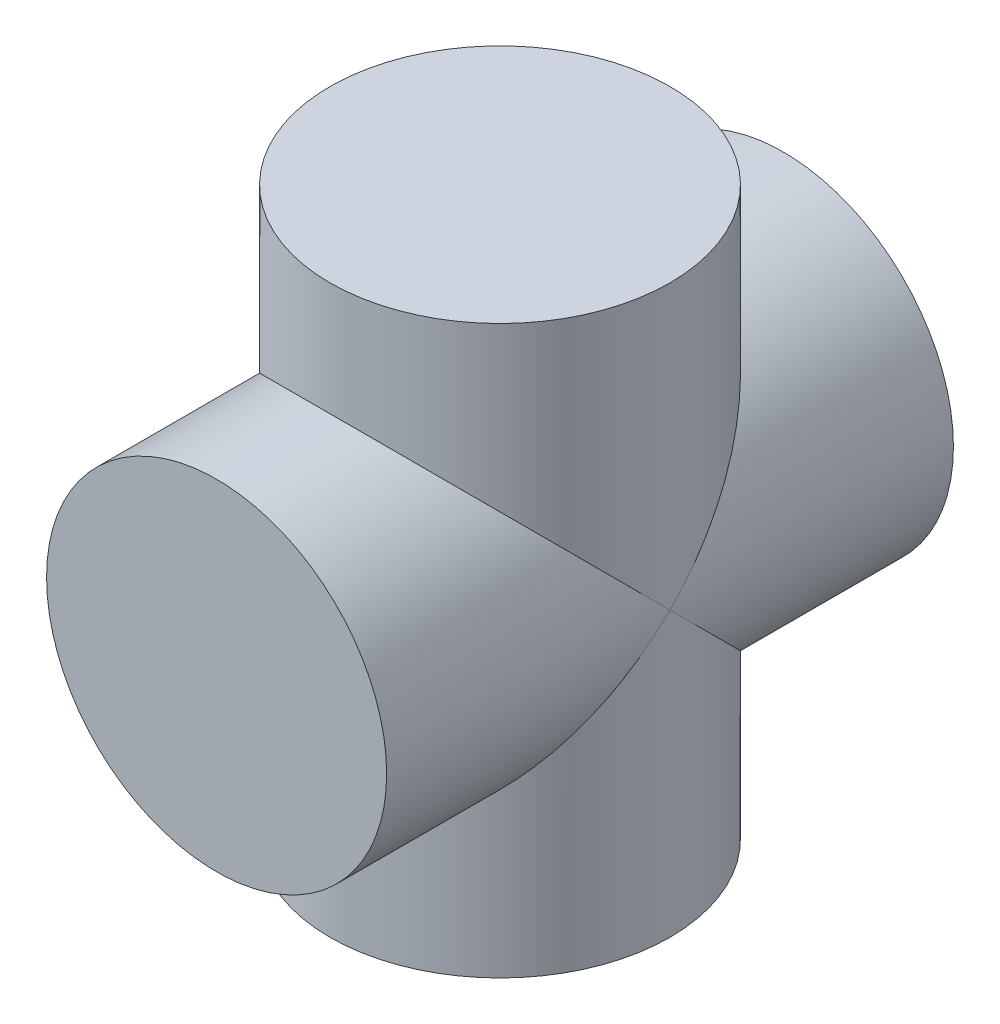
ISO-10303-21;
HEADER;
FILE_DESCRIPTION(('STEP AP214'),'2;1');
FILE_NAME('part.step','',(''),(''),'','','');
FILE_SCHEMA(('AUTOMOTIVE_DESIGN { 1 0 10303 214 1 1 1 1 }'));
ENDSEC;
DATA;
#1=APPLICATION_CONTEXT('core data for automotive mechanical design processes');
#2=APPLICATION_PROTOCOL_DEFINITION('international standard','automotive_design',2000,#1);
#3=PRODUCT_CONTEXT('',#1,'mechanical');
#4=PRODUCT('Part','Part','',(#3));
#5=PRODUCT_RELATED_PRODUCT_CATEGORY('part','',(#4));
#6=PRODUCT_DEFINITION_FORMATION('','',#4);
#7=PRODUCT_DEFINITION_CONTEXT('part definition',#1,'design');
#8=PRODUCT_DEFINITION('design','',#6,#7);
#9=PRODUCT_DEFINITION_SHAPE('','',#8);
#10=(LENGTH_UNIT() NAMED_UNIT(*) SI_UNIT(.MILLI.,.METRE.));
#11=(NAMED_UNIT(*) PLANE_ANGLE_UNIT() SI_UNIT($,.RADIAN.));
#12=(NAMED_UNIT(*) SI_UNIT($,.STERADIAN.) SOLID_ANGLE_UNIT());
#13=UNCERTAINTY_MEASURE_WITH_UNIT(LENGTH_MEASURE(1.E-05),#10,'distance_accuracy_value','');
#14=(GEOMETRIC_REPRESENTATION_CONTEXT(3) GLOBAL_UNCERTAINTY_ASSIGNED_CONTEXT((#13)) GLOBAL_UNIT_ASSIGNED_CONTEXT((#10,
#11,#12)) REPRESENTATION_CONTEXT('',''));
#15=CARTESIAN_POINT('',(0.,0.,0.));
#16=DIRECTION('',(0.,0.,1.));
#17=DIRECTION('',(1.,0.,0.));
#18=AXIS2_PLACEMENT_3D('',#15,#16,#17);
#19=CARTESIAN_POINT('',(0.,0.,50.));
#20=DIRECTION('',(0.,0.,-1.));
#21=DIRECTION('',(-1.,0.,0.));
#22=AXIS2_PLACEMENT_3D('',#19,#20,#21);
#23=CYLINDRICAL_SURFACE('',#22,30.);
#24=CARTESIAN_POINT('',(0.,0.,50.));
#25=DIRECTION('',(0.,0.,1.));
#26=DIRECTION('',(1.,0.,0.));
#27=AXIS2_PLACEMENT_3D('',#24,#25,#26);
#28=CIRCLE('',#27,30.);
#29=CARTESIAN_POINT('',(30.,0.,50.));
#30=VERTEX_POINT('',#29);
#31=EDGE_CURVE('E61',#30,#30,#28,.T.);
#32=ORIENTED_EDGE('',*,*,#31,.F.);
#33=EDGE_LOOP('',(#32));
#34=FACE_BOUND('',#33,.T.);
#35=CARTESIAN_POINT('',(0.,0.,0.));
#36=DIRECTION('',(0.,-0.707106781186547,-0.707106781186547));
#37=DIRECTION('',(0.,0.707106781186547,-0.707106781186547));
#38=AXIS2_PLACEMENT_3D('',#35,#36,#37);
#39=ELLIPSE('',#38,42.4264068711928,30.);
#40=CARTESIAN_POINT('',(30.,0.,0.));
#41=VERTEX_POINT('',#40);
#42=CARTESIAN_POINT('',(-30.,0.,0.));
#43=VERTEX_POINT('',#42);
#44=EDGE_CURVE('E45',#41,#43,#39,.T.);
#45=ORIENTED_EDGE('',*,*,#44,.F.);
#46=CARTESIAN_POINT('',(0.,0.,0.));
#47=DIRECTION('',(0.,0.707106781186547,-0.707106781186547));
#48=DIRECTION('',(0.,-0.707106781186547,-0.707106781186547));
#49=AXIS2_PLACEMENT_3D('',#46,#47,#48);
#50=ELLIPSE('',#49,42.4264068711928,30.);
#51=EDGE_CURVE('E57',#43,#41,#50,.T.);
#52=ORIENTED_EDGE('',*,*,#51,.F.);
#53=EDGE_LOOP('',(#45,#52));
#54=FACE_BOUND('',#53,.T.);
#55=ADVANCED_FACE('F37',(#34,#54),#23,.T.);
#56=CARTESIAN_POINT('',(0.,0.,50.));
#57=DIRECTION('',(0.,0.,1.));
#58=DIRECTION('',(1.,0.,0.));
#59=AXIS2_PLACEMENT_3D('',#56,#57,#58);
#60=PLANE('',#59);
#61=ORIENTED_EDGE('',*,*,#31,.T.);
#62=EDGE_LOOP('',(#61));
#63=FACE_BOUND('',#62,.T.);
#64=ADVANCED_FACE('F84',(#63),#60,.T.);
#65=CARTESIAN_POINT('',(0.,-50.,0.));
#66=DIRECTION('',(0.,1.,0.));
#67=DIRECTION('',(0.,0.,1.));
#68=AXIS2_PLACEMENT_3D('',#65,#66,#67);
#69=PLANE('',#68);
#70=CARTESIAN_POINT('',(0.,-50.,0.));
#71=DIRECTION('',(0.,1.,0.));
#72=DIRECTION('',(0.,0.,1.));
#73=AXIS2_PLACEMENT_3D('',#70,#71,#72);
#74=CIRCLE('',#73,30.);
#75=CARTESIAN_POINT('',(0.,-50.,30.));
#76=VERTEX_POINT('',#75);
#77=EDGE_CURVE('E98',#76,#76,#74,.T.);
#78=ORIENTED_EDGE('',*,*,#77,.F.);
#79=EDGE_LOOP('',(#78));
#80=FACE_BOUND('',#79,.T.);
#81=ADVANCED_FACE('F81',(#80),#69,.F.);
#82=CARTESIAN_POINT('',(0.,50.,0.));
#83=DIRECTION('',(0.,-1.,0.));
#84=DIRECTION('',(0.,0.,-1.));
#85=AXIS2_PLACEMENT_3D('',#82,#83,#84);
#86=CYLINDRICAL_SURFACE('',#85,30.);
#87=ORIENTED_EDGE('',*,*,#77,.T.);
#88=EDGE_LOOP('',(#87));
#89=FACE_BOUND('',#88,.T.);
#90=CARTESIAN_POINT('',(0.,0.,0.));
#91=DIRECTION('',(0.,0.707106781186547,-0.707106781186547));
#92=DIRECTION('',(0.,-0.707106781186547,-0.707106781186547));
#93=AXIS2_PLACEMENT_3D('',#90,#91,#92);
#94=ELLIPSE('',#93,42.4264068711928,30.);
#95=EDGE_CURVE('E51',#43,#41,#94,.F.);
#96=ORIENTED_EDGE('',*,*,#95,.T.);
#97=ORIENTED_EDGE('',*,*,#44,.T.);
#98=EDGE_LOOP('',(#96,#97));
#99=FACE_BOUND('',#98,.T.);
#100=ADVANCED_FACE('F63',(#89,#99),#86,.T.);
#101=CARTESIAN_POINT('',(0.,0.,-50.));
#102=DIRECTION('',(0.,0.,1.));
#103=DIRECTION('',(1.,0.,0.));
#104=AXIS2_PLACEMENT_3D('',#101,#102,#103);
#105=PLANE('',#104);
#106=CARTESIAN_POINT('',(0.,0.,-50.));
#107=DIRECTION('',(0.,0.,1.));
#108=DIRECTION('',(1.,0.,0.));
#109=AXIS2_PLACEMENT_3D('',#106,#107,#108);
#110=CIRCLE('',#109,30.);
#111=CARTESIAN_POINT('',(30.,0.,-50.));
#112=VERTEX_POINT('',#111);
#113=EDGE_CURVE('E92',#112,#112,#110,.T.);
#114=ORIENTED_EDGE('',*,*,#113,.F.);
#115=EDGE_LOOP('',(#114));
#116=FACE_BOUND('',#115,.T.);
#117=ADVANCED_FACE('F75',(#116),#105,.F.);
#118=ORIENTED_EDGE('',*,*,#113,.T.);
#119=EDGE_LOOP('',(#118));
#120=FACE_BOUND('',#119,.T.);
#121=CARTESIAN_POINT('',(0.,0.,0.));
#122=DIRECTION('',(0.,-0.707106781186547,-0.707106781186547));
#123=DIRECTION('',(0.,0.707106781186547,-0.707106781186547));
#124=AXIS2_PLACEMENT_3D('',#121,#122,#123);
#125=ELLIPSE('',#124,42.4264068711928,30.);
#126=EDGE_CURVE('E11',#41,#43,#125,.F.);
#127=ORIENTED_EDGE('',*,*,#126,.F.);
#128=ORIENTED_EDGE('',*,*,#95,.F.);
#129=EDGE_LOOP('',(#127,#128));
#130=FACE_BOUND('',#129,.T.);
#131=ADVANCED_FACE('F39',(#120,#130),#23,.T.);
#132=CARTESIAN_POINT('',(0.,50.,0.));
#133=DIRECTION('',(0.,1.,0.));
#134=DIRECTION('',(0.,0.,1.));
#135=AXIS2_PLACEMENT_3D('',#132,#133,#134);
#136=CIRCLE('',#135,30.);
#137=CARTESIAN_POINT('',(0.,50.,30.));
#138=VERTEX_POINT('',#137);
#139=EDGE_CURVE('E95',#138,#138,#136,.T.);
#140=ORIENTED_EDGE('',*,*,#139,.F.);
#141=EDGE_LOOP('',(#140));
#142=FACE_BOUND('',#141,.T.);
#143=ORIENTED_EDGE('',*,*,#51,.T.);
#144=ORIENTED_EDGE('',*,*,#126,.T.);
#145=EDGE_LOOP('',(#143,#144));
#146=FACE_BOUND('',#145,.T.);
#147=ADVANCED_FACE('F64',(#142,#146),#86,.T.);
#148=CARTESIAN_POINT('',(0.,50.,0.));
#149=DIRECTION('',(0.,1.,0.));
#150=DIRECTION('',(0.,0.,1.));
#151=AXIS2_PLACEMENT_3D('',#148,#149,#150);
#152=PLANE('',#151);
#153=ORIENTED_EDGE('',*,*,#139,.T.);
#154=EDGE_LOOP('',(#153));
#155=FACE_BOUND('',#154,.T.);
#156=ADVANCED_FACE('F66',(#155),#152,.T.);
#157=CLOSED_SHELL('',(#55,#64,#81,#100,#117,#131,#147,#156));
#158=MANIFOLD_SOLID_BREP('B2',#157);
#159=ADVANCED_BREP_SHAPE_REPRESENTATION('',(#18,#158),#14);
#160=SHAPE_DEFINITION_REPRESENTATION(#9,#159);
ENDSEC;
END-ISO-10303-21;
